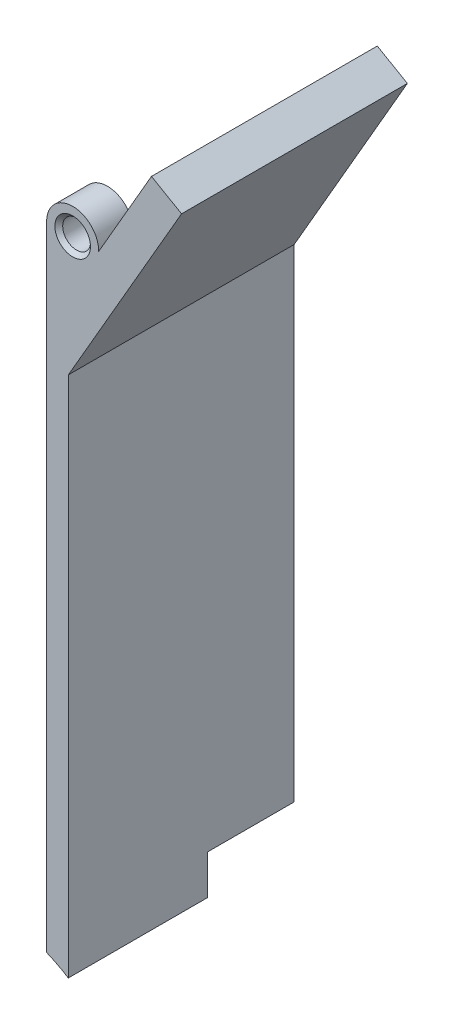
ISO-10303-21;
HEADER;
FILE_DESCRIPTION(('STEP AP214'),'2;1');
FILE_NAME('part.step','',(''),(''),'','','');
FILE_SCHEMA(('AUTOMOTIVE_DESIGN { 1 0 10303 214 1 1 1 1 }'));
ENDSEC;
DATA;
#1=APPLICATION_CONTEXT('core data for automotive mechanical design processes');
#2=APPLICATION_PROTOCOL_DEFINITION('international standard','automotive_design',2000,#1);
#3=PRODUCT_CONTEXT('',#1,'mechanical');
#4=PRODUCT('Part','Part','',(#3));
#5=PRODUCT_RELATED_PRODUCT_CATEGORY('part','',(#4));
#6=PRODUCT_DEFINITION_FORMATION('','',#4);
#7=PRODUCT_DEFINITION_CONTEXT('part definition',#1,'design');
#8=PRODUCT_DEFINITION('design','',#6,#7);
#9=PRODUCT_DEFINITION_SHAPE('','',#8);
#10=(LENGTH_UNIT() NAMED_UNIT(*) SI_UNIT(.MILLI.,.METRE.));
#11=(NAMED_UNIT(*) PLANE_ANGLE_UNIT() SI_UNIT($,.RADIAN.));
#12=(NAMED_UNIT(*) SI_UNIT($,.STERADIAN.) SOLID_ANGLE_UNIT());
#13=UNCERTAINTY_MEASURE_WITH_UNIT(LENGTH_MEASURE(1.E-05),#10,'distance_accuracy_value','');
#14=(GEOMETRIC_REPRESENTATION_CONTEXT(3) GLOBAL_UNCERTAINTY_ASSIGNED_CONTEXT((#13)) GLOBAL_UNIT_ASSIGNED_CONTEXT((#10,
#11,#12)) REPRESENTATION_CONTEXT('',''));
#15=CARTESIAN_POINT('',(0.,0.,0.));
#16=DIRECTION('',(0.,0.,1.));
#17=DIRECTION('',(1.,0.,0.));
#18=AXIS2_PLACEMENT_3D('',#15,#16,#17);
#19=CARTESIAN_POINT('',(60.1746976504819,0.,-15.));
#20=DIRECTION('',(1.,0.,0.));
#21=DIRECTION('',(0.,0.,1.));
#22=AXIS2_PLACEMENT_3D('',#19,#20,#21);
#23=PLANE('',#22);
#24=DIRECTION('',(0.,-1.,0.));
#25=VECTOR('',#24,1.);
#26=CARTESIAN_POINT('',(60.1746976504819,0.,-13.));
#27=LINE('',#26,#25);
#28=CARTESIAN_POINT('',(60.1746976504819,-38.1610373207469,-13.));
#29=VERTEX_POINT('',#28);
#30=CARTESIAN_POINT('',(60.1746976504819,-41.5716731926929,-13.));
#31=VERTEX_POINT('',#30);
#32=EDGE_CURVE('E180',#29,#31,#27,.T.);
#33=ORIENTED_EDGE('',*,*,#32,.T.);
#34=DIRECTION('',(0.,0.,-1.));
#35=VECTOR('',#34,1.);
#36=CARTESIAN_POINT('',(60.1746976504819,-41.5716731926929,-10.));
#37=LINE('',#36,#35);
#38=CARTESIAN_POINT('',(60.1746976504819,-41.5716731926929,-10.));
#39=VERTEX_POINT('',#38);
#40=EDGE_CURVE('E195',#39,#31,#37,.T.);
#41=ORIENTED_EDGE('',*,*,#40,.F.);
#42=DIRECTION('',(0.,-1.,0.));
#43=VECTOR('',#42,1.);
#44=CARTESIAN_POINT('',(60.1746976504819,0.,-10.));
#45=LINE('',#44,#43);
#46=CARTESIAN_POINT('',(60.1746976504819,-43.7084380241115,-10.));
#47=VERTEX_POINT('',#46);
#48=EDGE_CURVE('E57',#39,#47,#45,.T.);
#49=ORIENTED_EDGE('',*,*,#48,.T.);
#50=DIRECTION('',(0.,0.,1.));
#51=VECTOR('',#50,1.);
#52=CARTESIAN_POINT('',(60.1746976504819,-43.7084380241115,-15.));
#53=LINE('',#52,#51);
#54=CARTESIAN_POINT('',(60.1746976504819,-43.7084380241115,-2.));
#55=VERTEX_POINT('',#54);
#56=EDGE_CURVE('E220',#47,#55,#53,.T.);
#57=ORIENTED_EDGE('',*,*,#56,.T.);
#58=DIRECTION('',(0.,-1.,0.));
#59=VECTOR('',#58,1.);
#60=CARTESIAN_POINT('',(60.1746976504819,0.,-2.));
#61=LINE('',#60,#59);
#62=CARTESIAN_POINT('',(60.1746976504819,-7.25675770754768,-2.));
#63=VERTEX_POINT('',#62);
#64=EDGE_CURVE('E169',#63,#55,#61,.T.);
#65=ORIENTED_EDGE('',*,*,#64,.F.);
#66=DIRECTION('',(0.,0.,1.));
#67=VECTOR('',#66,1.);
#68=CARTESIAN_POINT('',(60.1746976504819,-7.25675770754768,-4.));
#69=LINE('',#68,#67);
#70=CARTESIAN_POINT('',(60.1746976504819,-7.25675770754768,-4.));
#71=VERTEX_POINT('',#70);
#72=EDGE_CURVE('E151',#71,#63,#69,.T.);
#73=ORIENTED_EDGE('',*,*,#72,.F.);
#74=DIRECTION('',(0.,1.,0.));
#75=VECTOR('',#74,1.);
#76=CARTESIAN_POINT('',(60.1746976504819,0.,-4.));
#77=LINE('',#76,#75);
#78=CARTESIAN_POINT('',(60.1746976504819,-12.4529101302543,-4.));
#79=VERTEX_POINT('',#78);
#80=EDGE_CURVE('E157',#79,#71,#77,.T.);
#81=ORIENTED_EDGE('',*,*,#80,.F.);
#82=DIRECTION('',(0.,0.,1.));
#83=VECTOR('',#82,1.);
#84=CARTESIAN_POINT('',(60.1746976504819,-12.4529101302543,-15.));
#85=LINE('',#84,#83);
#86=CARTESIAN_POINT('',(60.1746976504819,-12.4529101302543,-15.));
#87=VERTEX_POINT('',#86);
#88=EDGE_CURVE('E243',#87,#79,#85,.T.);
#89=ORIENTED_EDGE('',*,*,#88,.F.);
#90=DIRECTION('',(0.,-1.,0.));
#91=VECTOR('',#90,1.);
#92=CARTESIAN_POINT('',(60.1746976504819,0.,-15.));
#93=LINE('',#92,#91);
#94=CARTESIAN_POINT('',(60.1746976504819,-38.1610373207469,-15.));
#95=VERTEX_POINT('',#94);
#96=EDGE_CURVE('E208',#87,#95,#93,.T.);
#97=ORIENTED_EDGE('',*,*,#96,.T.);
#98=DIRECTION('',(0.,0.,-1.));
#99=VECTOR('',#98,1.);
#100=CARTESIAN_POINT('',(60.1746976504819,-38.1610373207469,-13.));
#101=LINE('',#100,#99);
#102=EDGE_CURVE('E190',#29,#95,#101,.T.);
#103=ORIENTED_EDGE('',*,*,#102,.F.);
#104=EDGE_LOOP('',(#33,#41,#49,#57,#65,#73,#81,#89,#97,#103));
#105=FACE_BOUND('',#104,.T.);
#106=ADVANCED_FACE('F48',(#105),#23,.F.);
#107=CARTESIAN_POINT('',(56.6746976504819,-52.,-15.));
#108=DIRECTION('',(0.,0.,1.));
#109=DIRECTION('',(-1.,0.,0.));
#110=AXIS2_PLACEMENT_3D('',#107,#108,#109);
#111=CYLINDRICAL_SURFACE('',#110,9.);
#112=CARTESIAN_POINT('',(56.6746976504819,-52.,-10.));
#113=DIRECTION('',(0.,0.,1.));
#114=DIRECTION('',(1.,0.,0.));
#115=AXIS2_PLACEMENT_3D('',#112,#113,#114);
#116=CIRCLE('',#115,9.);
#117=CARTESIAN_POINT('',(61.4246976504819,-44.3555575742897,-10.));
#118=VERTEX_POINT('',#117);
#119=EDGE_CURVE('E202',#47,#118,#116,.F.);
#120=ORIENTED_EDGE('',*,*,#119,.T.);
#121=DIRECTION('',(0.,0.,1.));
#122=VECTOR('',#121,1.);
#123=CARTESIAN_POINT('',(61.4246976504819,-44.3555575742896,-15.));
#124=LINE('',#123,#122);
#125=CARTESIAN_POINT('',(61.4246976504819,-44.3555575742896,-2.));
#126=VERTEX_POINT('',#125);
#127=EDGE_CURVE('E231',#118,#126,#124,.T.);
#128=ORIENTED_EDGE('',*,*,#127,.T.);
#129=CARTESIAN_POINT('',(56.6746976504819,-52.,-2.));
#130=DIRECTION('',(0.,0.,-1.));
#131=DIRECTION('',(-1.,0.,0.));
#132=AXIS2_PLACEMENT_3D('',#129,#130,#131);
#133=CIRCLE('',#132,9.);
#134=EDGE_CURVE('E207',#55,#126,#133,.T.);
#135=ORIENTED_EDGE('',*,*,#134,.F.);
#136=ORIENTED_EDGE('',*,*,#56,.F.);
#137=EDGE_LOOP('',(#120,#128,#135,#136));
#138=FACE_BOUND('',#137,.T.);
#139=ADVANCED_FACE('F50',(#138),#111,.F.);
#140=CARTESIAN_POINT('',(61.4246976504819,0.,-15.));
#141=DIRECTION('',(1.,0.,0.));
#142=DIRECTION('',(0.,-1.,0.));
#143=AXIS2_PLACEMENT_3D('',#140,#141,#142);
#144=PLANE('',#143);
#145=DIRECTION('',(0.,0.,-1.));
#146=VECTOR('',#145,1.);
#147=CARTESIAN_POINT('',(61.4246976504819,-42.0784325835078,-10.));
#148=LINE('',#147,#146);
#149=CARTESIAN_POINT('',(61.4246976504819,-42.0784325835078,-10.));
#150=VERTEX_POINT('',#149);
#151=CARTESIAN_POINT('',(61.4246976504819,-42.0784325835078,-15.));
#152=VERTEX_POINT('',#151);
#153=EDGE_CURVE('E199',#150,#152,#148,.T.);
#154=ORIENTED_EDGE('',*,*,#153,.T.);
#155=DIRECTION('',(0.,-1.,0.));
#156=VECTOR('',#155,1.);
#157=CARTESIAN_POINT('',(61.4246976504819,0.,-15.));
#158=LINE('',#157,#156);
#159=CARTESIAN_POINT('',(61.4246976504819,-14.2878466207932,-15.));
#160=VERTEX_POINT('',#159);
#161=EDGE_CURVE('E218',#160,#152,#158,.T.);
#162=ORIENTED_EDGE('',*,*,#161,.F.);
#163=DIRECTION('',(0.,0.,1.));
#164=VECTOR('',#163,1.);
#165=CARTESIAN_POINT('',(61.4246976504819,-14.2878466207932,-15.));
#166=LINE('',#165,#164);
#167=CARTESIAN_POINT('',(61.4246976504819,-14.2878466207932,-2.));
#168=VERTEX_POINT('',#167);
#169=EDGE_CURVE('E234',#160,#168,#166,.T.);
#170=ORIENTED_EDGE('',*,*,#169,.T.);
#171=DIRECTION('',(0.,-1.,0.));
#172=VECTOR('',#171,1.);
#173=CARTESIAN_POINT('',(61.4246976504819,0.,-2.));
#174=LINE('',#173,#172);
#175=EDGE_CURVE('E212',#168,#126,#174,.T.);
#176=ORIENTED_EDGE('',*,*,#175,.T.);
#177=ORIENTED_EDGE('',*,*,#127,.F.);
#178=DIRECTION('',(0.,-1.,0.));
#179=VECTOR('',#178,1.);
#180=CARTESIAN_POINT('',(61.4246976504819,0.,-10.));
#181=LINE('',#180,#179);
#182=EDGE_CURVE('E205',#150,#118,#181,.T.);
#183=ORIENTED_EDGE('',*,*,#182,.F.);
#184=EDGE_LOOP('',(#154,#162,#170,#176,#177,#183));
#185=FACE_BOUND('',#184,.T.);
#186=ADVANCED_FACE('F284',(#185),#144,.T.);
#187=CARTESIAN_POINT('',(67.9417389355681,-2.99999999999999,-15.));
#188=DIRECTION('',(0.86602540378444,-0.499999999999998,0.));
#189=DIRECTION('',(-0.499999999999998,-0.86602540378444,0.));
#190=AXIS2_PLACEMENT_3D('',#187,#188,#189);
#191=PLANE('',#190);
#192=DIRECTION('',(-0.499999999999998,-0.86602540378444,0.));
#193=VECTOR('',#192,1.);
#194=CARTESIAN_POINT('',(67.9417389355681,-2.99999999999999,-2.));
#195=LINE('',#194,#193);
#196=CARTESIAN_POINT('',(67.9417389355681,-2.99999999999997,-2.));
#197=VERTEX_POINT('',#196);
#198=EDGE_CURVE('E228',#197,#168,#195,.T.);
#199=ORIENTED_EDGE('',*,*,#198,.T.);
#200=ORIENTED_EDGE('',*,*,#169,.F.);
#201=DIRECTION('',(-0.499999999999998,-0.86602540378444,0.));
#202=VECTOR('',#201,1.);
#203=CARTESIAN_POINT('',(67.9417389355681,-2.99999999999999,-15.));
#204=LINE('',#203,#202);
#205=CARTESIAN_POINT('',(67.9417389355681,-2.99999999999997,-15.));
#206=VERTEX_POINT('',#205);
#207=EDGE_CURVE('E216',#206,#160,#204,.T.);
#208=ORIENTED_EDGE('',*,*,#207,.F.);
#209=DIRECTION('',(0.,0.,1.));
#210=VECTOR('',#209,1.);
#211=CARTESIAN_POINT('',(67.9417389355681,-2.99999999999997,-15.));
#212=LINE('',#211,#210);
#213=EDGE_CURVE('E237',#206,#197,#212,.T.);
#214=ORIENTED_EDGE('',*,*,#213,.T.);
#215=EDGE_LOOP('',(#199,#200,#208,#214));
#216=FACE_BOUND('',#215,.T.);
#217=ADVANCED_FACE('F294',(#216),#191,.T.);
#218=CARTESIAN_POINT('',(62.7455865128615,0.,-15.));
#219=DIRECTION('',(0.499999999999999,0.866025403784439,0.));
#220=DIRECTION('',(0.86602540378444,-0.499999999999999,0.));
#221=AXIS2_PLACEMENT_3D('',#218,#219,#220);
#222=PLANE('',#221);
#223=DIRECTION('',(0.86602540378444,-0.499999999999999,0.));
#224=VECTOR('',#223,1.);
#225=CARTESIAN_POINT('',(62.7455865128615,0.,-2.));
#226=LINE('',#225,#224);
#227=CARTESIAN_POINT('',(66.2096881279992,-1.99999999999997,-2.));
#228=VERTEX_POINT('',#227);
#229=EDGE_CURVE('E226',#228,#197,#226,.T.);
#230=ORIENTED_EDGE('',*,*,#229,.T.);
#231=ORIENTED_EDGE('',*,*,#213,.F.);
#232=DIRECTION('',(0.86602540378444,-0.499999999999999,0.));
#233=VECTOR('',#232,1.);
#234=CARTESIAN_POINT('',(62.7455865128615,0.,-15.));
#235=LINE('',#234,#233);
#236=CARTESIAN_POINT('',(66.2096881279992,-1.99999999999997,-15.));
#237=VERTEX_POINT('',#236);
#238=EDGE_CURVE('E214',#237,#206,#235,.T.);
#239=ORIENTED_EDGE('',*,*,#238,.F.);
#240=DIRECTION('',(0.,0.,1.));
#241=VECTOR('',#240,1.);
#242=CARTESIAN_POINT('',(66.2096881279992,-1.99999999999997,-15.));
#243=LINE('',#242,#241);
#244=EDGE_CURVE('E240',#237,#228,#243,.T.);
#245=ORIENTED_EDGE('',*,*,#244,.T.);
#246=EDGE_LOOP('',(#230,#231,#239,#245));
#247=FACE_BOUND('',#246,.T.);
#248=ADVANCED_FACE('F290',(#247),#222,.T.);
#249=CARTESIAN_POINT('',(66.2096881279992,-1.99999999999999,-15.));
#250=DIRECTION('',(-0.86602540378444,0.499999999999998,0.));
#251=DIRECTION('',(0.499999999999998,0.86602540378444,0.));
#252=AXIS2_PLACEMENT_3D('',#249,#250,#251);
#253=PLANE('',#252);
#254=DIRECTION('',(0.,0.,1.));
#255=VECTOR('',#254,1.);
#256=CARTESIAN_POINT('',(63.1746976504819,-7.25675770754767,-4.));
#257=LINE('',#256,#255);
#258=CARTESIAN_POINT('',(63.1746976504819,-7.25675770754767,-4.));
#259=VERTEX_POINT('',#258);
#260=CARTESIAN_POINT('',(63.1746976504819,-7.25675770754767,-2.));
#261=VERTEX_POINT('',#260);
#262=EDGE_CURVE('E154',#259,#261,#257,.T.);
#263=ORIENTED_EDGE('',*,*,#262,.T.);
#264=DIRECTION('',(0.499999999999998,0.86602540378444,0.));
#265=VECTOR('',#264,1.);
#266=CARTESIAN_POINT('',(66.2096881279992,-1.99999999999999,-2.));
#267=LINE('',#266,#265);
#268=EDGE_CURVE('E224',#261,#228,#267,.T.);
#269=ORIENTED_EDGE('',*,*,#268,.T.);
#270=ORIENTED_EDGE('',*,*,#244,.F.);
#271=DIRECTION('',(0.499999999999998,0.86602540378444,0.));
#272=VECTOR('',#271,1.);
#273=CARTESIAN_POINT('',(66.2096881279992,-1.99999999999999,-15.));
#274=LINE('',#273,#272);
#275=EDGE_CURVE('E211',#87,#237,#274,.T.);
#276=ORIENTED_EDGE('',*,*,#275,.F.);
#277=ORIENTED_EDGE('',*,*,#88,.T.);
#278=DIRECTION('',(-0.499999999999998,-0.86602540378444,0.));
#279=VECTOR('',#278,1.);
#280=CARTESIAN_POINT('',(66.2096881279992,-1.99999999999999,-4.));
#281=LINE('',#280,#279);
#282=EDGE_CURVE('E12',#259,#79,#281,.T.);
#283=ORIENTED_EDGE('',*,*,#282,.F.);
#284=EDGE_LOOP('',(#263,#269,#270,#276,#277,#283));
#285=FACE_BOUND('',#284,.T.);
#286=ADVANCED_FACE('F287',(#285),#253,.T.);
#287=CARTESIAN_POINT('',(62.7455865128615,0.,-15.));
#288=DIRECTION('',(0.,0.,1.));
#289=DIRECTION('',(-1.,0.,0.));
#290=AXIS2_PLACEMENT_3D('',#287,#288,#289);
#291=PLANE('',#290);
#292=CARTESIAN_POINT('',(58.6746976504819,-39.6610373207469,-15.));
#293=DIRECTION('',(0.,0.,1.));
#294=DIRECTION('',(1.,0.,0.));
#295=AXIS2_PLACEMENT_3D('',#292,#293,#294);
#296=CIRCLE('',#295,1.025);
#297=CARTESIAN_POINT('',(59.6996976504819,-39.6610373207469,-15.));
#298=VERTEX_POINT('',#297);
#299=EDGE_CURVE('E263',#298,#298,#296,.T.);
#300=ORIENTED_EDGE('',*,*,#299,.T.);
#301=EDGE_LOOP('',(#300));
#302=FACE_BOUND('',#301,.T.);
#303=ORIENTED_EDGE('',*,*,#96,.F.);
#304=ORIENTED_EDGE('',*,*,#275,.T.);
#305=ORIENTED_EDGE('',*,*,#238,.T.);
#306=ORIENTED_EDGE('',*,*,#207,.T.);
#307=ORIENTED_EDGE('',*,*,#161,.T.);
#308=CARTESIAN_POINT('',(56.6746976504819,-52.,-15.));
#309=DIRECTION('',(0.,0.,1.));
#310=DIRECTION('',(1.,0.,0.));
#311=AXIS2_PLACEMENT_3D('',#308,#309,#310);
#312=CIRCLE('',#311,11.);
#313=CARTESIAN_POINT('',(58.4346976504819,-41.1417128422573,-15.));
#314=VERTEX_POINT('',#313);
#315=EDGE_CURVE('E73',#152,#314,#312,.T.);
#316=ORIENTED_EDGE('',*,*,#315,.T.);
#317=CARTESIAN_POINT('',(58.6746976504819,-39.6610373207469,-15.));
#318=DIRECTION('',(0.,0.,1.));
#319=DIRECTION('',(1.,0.,0.));
#320=AXIS2_PLACEMENT_3D('',#317,#318,#319);
#321=CIRCLE('',#320,1.5);
#322=CARTESIAN_POINT('',(58.6746976504819,-38.1610373207469,-15.));
#323=VERTEX_POINT('',#322);
#324=EDGE_CURVE('E171',#323,#314,#321,.T.);
#325=ORIENTED_EDGE('',*,*,#324,.F.);
#326=DIRECTION('',(1.,0.,0.));
#327=VECTOR('',#326,1.);
#328=CARTESIAN_POINT('',(62.7455865128615,-38.1610373207469,-15.));
#329=LINE('',#328,#327);
#330=EDGE_CURVE('E65',#323,#95,#329,.T.);
#331=ORIENTED_EDGE('',*,*,#330,.T.);
#332=EDGE_LOOP('',(#303,#304,#305,#306,#307,#316,#325,#331));
#333=FACE_BOUND('',#332,.T.);
#334=ADVANCED_FACE('F267',(#302,#333),#291,.F.);
#335=CARTESIAN_POINT('',(62.7455865128615,0.,-2.));
#336=DIRECTION('',(0.,0.,1.));
#337=DIRECTION('',(-1.,0.,0.));
#338=AXIS2_PLACEMENT_3D('',#335,#336,#337);
#339=PLANE('',#338);
#340=CARTESIAN_POINT('',(61.6746976504819,-7.25675770754768,-2.));
#341=DIRECTION('',(0.,0.,-1.));
#342=DIRECTION('',(-1.,0.,0.));
#343=AXIS2_PLACEMENT_3D('',#340,#341,#342);
#344=CIRCLE('',#343,1.025);
#345=CARTESIAN_POINT('',(60.6496976504819,-7.25675770754768,-2.));
#346=VERTEX_POINT('',#345);
#347=EDGE_CURVE('E253',#346,#346,#344,.T.);
#348=ORIENTED_EDGE('',*,*,#347,.T.);
#349=EDGE_LOOP('',(#348));
#350=FACE_BOUND('',#349,.T.);
#351=CARTESIAN_POINT('',(61.6746976504819,-7.25675770754768,-2.));
#352=DIRECTION('',(0.,0.,-1.));
#353=DIRECTION('',(-1.,0.,0.));
#354=AXIS2_PLACEMENT_3D('',#351,#352,#353);
#355=CIRCLE('',#354,1.5);
#356=EDGE_CURVE('E164',#63,#261,#355,.T.);
#357=ORIENTED_EDGE('',*,*,#356,.F.);
#358=ORIENTED_EDGE('',*,*,#64,.T.);
#359=ORIENTED_EDGE('',*,*,#134,.T.);
#360=ORIENTED_EDGE('',*,*,#175,.F.);
#361=ORIENTED_EDGE('',*,*,#198,.F.);
#362=ORIENTED_EDGE('',*,*,#229,.F.);
#363=ORIENTED_EDGE('',*,*,#268,.F.);
#364=EDGE_LOOP('',(#357,#358,#359,#360,#361,#362,#363));
#365=FACE_BOUND('',#364,.T.);
#366=ADVANCED_FACE('F302',(#350,#365),#339,.T.);
#367=CARTESIAN_POINT('',(56.6746976504819,-52.,-10.));
#368=DIRECTION('',(0.,0.,-1.));
#369=DIRECTION('',(1.,0.,0.));
#370=AXIS2_PLACEMENT_3D('',#367,#368,#369);
#371=CYLINDRICAL_SURFACE('',#370,11.);
#372=ORIENTED_EDGE('',*,*,#153,.F.);
#373=CARTESIAN_POINT('',(56.6746976504819,-52.,-10.));
#374=DIRECTION('',(0.,0.,1.));
#375=DIRECTION('',(1.,0.,0.));
#376=AXIS2_PLACEMENT_3D('',#373,#374,#375);
#377=CIRCLE('',#376,11.);
#378=EDGE_CURVE('E193',#150,#39,#377,.T.);
#379=ORIENTED_EDGE('',*,*,#378,.T.);
#380=ORIENTED_EDGE('',*,*,#40,.T.);
#381=CARTESIAN_POINT('',(56.6746976504819,-52.,-13.));
#382=DIRECTION('',(0.,0.,1.));
#383=DIRECTION('',(1.,0.,0.));
#384=AXIS2_PLACEMENT_3D('',#381,#382,#383);
#385=CIRCLE('',#384,11.);
#386=CARTESIAN_POINT('',(58.4346976504819,-41.1417128422573,-13.));
#387=VERTEX_POINT('',#386);
#388=EDGE_CURVE('E177',#31,#387,#385,.T.);
#389=ORIENTED_EDGE('',*,*,#388,.T.);
#390=DIRECTION('',(0.,0.,-1.));
#391=VECTOR('',#390,1.);
#392=CARTESIAN_POINT('',(58.4346976504819,-41.1417128422573,-13.));
#393=LINE('',#392,#391);
#394=EDGE_CURVE('E184',#387,#314,#393,.T.);
#395=ORIENTED_EDGE('',*,*,#394,.T.);
#396=ORIENTED_EDGE('',*,*,#315,.F.);
#397=EDGE_LOOP('',(#372,#379,#380,#389,#395,#396));
#398=FACE_BOUND('',#397,.T.);
#399=ADVANCED_FACE('F305',(#398),#371,.F.);
#400=CARTESIAN_POINT('',(56.6746976504819,-52.,-10.));
#401=DIRECTION('',(0.,0.,-1.));
#402=DIRECTION('',(1.,0.,0.));
#403=AXIS2_PLACEMENT_3D('',#400,#401,#402);
#404=PLANE('',#403);
#405=ORIENTED_EDGE('',*,*,#378,.F.);
#406=ORIENTED_EDGE('',*,*,#182,.T.);
#407=ORIENTED_EDGE('',*,*,#119,.F.);
#408=ORIENTED_EDGE('',*,*,#48,.F.);
#409=EDGE_LOOP('',(#405,#406,#407,#408));
#410=FACE_BOUND('',#409,.T.);
#411=ADVANCED_FACE('F311',(#410),#404,.T.);
#412=CARTESIAN_POINT('',(58.6746976504819,-39.6610373207469,-13.));
#413=DIRECTION('',(0.,0.,-1.));
#414=DIRECTION('',(1.,0.,0.));
#415=AXIS2_PLACEMENT_3D('',#412,#413,#414);
#416=CYLINDRICAL_SURFACE('',#415,1.5);
#417=ORIENTED_EDGE('',*,*,#324,.T.);
#418=ORIENTED_EDGE('',*,*,#394,.F.);
#419=CARTESIAN_POINT('',(58.6746976504819,-39.6610373207469,-13.));
#420=DIRECTION('',(0.,0.,1.));
#421=DIRECTION('',(1.,0.,0.));
#422=AXIS2_PLACEMENT_3D('',#419,#420,#421);
#423=CIRCLE('',#422,1.5);
#424=CARTESIAN_POINT('',(58.6746976504819,-38.1610373207469,-13.));
#425=VERTEX_POINT('',#424);
#426=EDGE_CURVE('E175',#425,#387,#423,.T.);
#427=ORIENTED_EDGE('',*,*,#426,.F.);
#428=DIRECTION('',(0.,0.,-1.));
#429=VECTOR('',#428,1.);
#430=CARTESIAN_POINT('',(58.6746976504819,-38.1610373207469,-13.));
#431=LINE('',#430,#429);
#432=EDGE_CURVE('E188',#425,#323,#431,.T.);
#433=ORIENTED_EDGE('',*,*,#432,.T.);
#434=EDGE_LOOP('',(#417,#418,#427,#433));
#435=FACE_BOUND('',#434,.T.);
#436=ADVANCED_FACE('F314',(#435),#416,.T.);
#437=CARTESIAN_POINT('',(62.7455865128615,-38.1610373207469,-13.));
#438=DIRECTION('',(0.,-1.,0.));
#439=DIRECTION('',(0.,0.,-1.));
#440=AXIS2_PLACEMENT_3D('',#437,#438,#439);
#441=PLANE('',#440);
#442=ORIENTED_EDGE('',*,*,#330,.F.);
#443=ORIENTED_EDGE('',*,*,#432,.F.);
#444=DIRECTION('',(1.,0.,0.));
#445=VECTOR('',#444,1.);
#446=CARTESIAN_POINT('',(62.7455865128615,-38.1610373207469,-13.));
#447=LINE('',#446,#445);
#448=EDGE_CURVE('E182',#425,#29,#447,.T.);
#449=ORIENTED_EDGE('',*,*,#448,.T.);
#450=ORIENTED_EDGE('',*,*,#102,.T.);
#451=EDGE_LOOP('',(#442,#443,#449,#450));
#452=FACE_BOUND('',#451,.T.);
#453=ADVANCED_FACE('F318',(#452),#441,.F.);
#454=CARTESIAN_POINT('',(62.7455865128615,0.,-13.));
#455=DIRECTION('',(0.,0.,-1.));
#456=DIRECTION('',(1.,0.,0.));
#457=AXIS2_PLACEMENT_3D('',#454,#455,#456);
#458=PLANE('',#457);
#459=CARTESIAN_POINT('',(58.6746976504819,-39.6610373207469,-13.));
#460=DIRECTION('',(0.,0.,1.));
#461=DIRECTION('',(1.,0.,0.));
#462=AXIS2_PLACEMENT_3D('',#459,#460,#461);
#463=CIRCLE('',#462,0.799999999999989);
#464=CARTESIAN_POINT('',(59.4746976504819,-39.6610373207469,-13.));
#465=VERTEX_POINT('',#464);
#466=EDGE_CURVE('E52',#465,#465,#463,.T.);
#467=ORIENTED_EDGE('',*,*,#466,.F.);
#468=EDGE_LOOP('',(#467));
#469=FACE_BOUND('',#468,.T.);
#470=ORIENTED_EDGE('',*,*,#426,.T.);
#471=ORIENTED_EDGE('',*,*,#388,.F.);
#472=ORIENTED_EDGE('',*,*,#32,.F.);
#473=ORIENTED_EDGE('',*,*,#448,.F.);
#474=EDGE_LOOP('',(#470,#471,#472,#473));
#475=FACE_BOUND('',#474,.T.);
#476=ADVANCED_FACE('F322',(#469,#475),#458,.F.);
#477=CARTESIAN_POINT('',(61.6746976504819,-7.25675770754768,-4.));
#478=DIRECTION('',(0.,0.,1.));
#479=DIRECTION('',(-1.,0.,0.));
#480=AXIS2_PLACEMENT_3D('',#477,#478,#479);
#481=CYLINDRICAL_SURFACE('',#480,1.5);
#482=CARTESIAN_POINT('',(61.6746976504819,-7.25675770754768,-4.));
#483=DIRECTION('',(0.,0.,-1.));
#484=DIRECTION('',(-1.,0.,0.));
#485=AXIS2_PLACEMENT_3D('',#482,#483,#484);
#486=CIRCLE('',#485,1.5);
#487=EDGE_CURVE('E147',#71,#259,#486,.T.);
#488=ORIENTED_EDGE('',*,*,#487,.F.);
#489=ORIENTED_EDGE('',*,*,#72,.T.);
#490=ORIENTED_EDGE('',*,*,#356,.T.);
#491=ORIENTED_EDGE('',*,*,#262,.F.);
#492=EDGE_LOOP('',(#488,#489,#490,#491));
#493=FACE_BOUND('',#492,.T.);
#494=ADVANCED_FACE('F149',(#493),#481,.T.);
#495=CARTESIAN_POINT('',(62.7455865128615,0.,-4.));
#496=DIRECTION('',(0.,0.,1.));
#497=DIRECTION('',(-1.,0.,0.));
#498=AXIS2_PLACEMENT_3D('',#495,#496,#497);
#499=PLANE('',#498);
#500=CARTESIAN_POINT('',(61.6746976504819,-7.25675770754768,-4.));
#501=DIRECTION('',(0.,0.,-1.));
#502=DIRECTION('',(-1.,0.,0.));
#503=AXIS2_PLACEMENT_3D('',#500,#501,#502);
#504=CIRCLE('',#503,0.799999999999989);
#505=CARTESIAN_POINT('',(60.8746976504819,-7.25675770754768,-4.));
#506=VERTEX_POINT('',#505);
#507=EDGE_CURVE('E247',#506,#506,#504,.T.);
#508=ORIENTED_EDGE('',*,*,#507,.F.);
#509=EDGE_LOOP('',(#508));
#510=FACE_BOUND('',#509,.T.);
#511=ORIENTED_EDGE('',*,*,#282,.T.);
#512=ORIENTED_EDGE('',*,*,#80,.T.);
#513=ORIENTED_EDGE('',*,*,#487,.T.);
#514=EDGE_LOOP('',(#511,#512,#513));
#515=FACE_BOUND('',#514,.T.);
#516=ADVANCED_FACE('F160',(#510,#515),#499,.F.);
#517=CARTESIAN_POINT('',(61.6746976504819,-7.25675770754768,-2.));
#518=DIRECTION('',(0.,0.,1.));
#519=DIRECTION('',(-1.,0.,0.));
#520=AXIS2_PLACEMENT_3D('',#517,#518,#519);
#521=CYLINDRICAL_SURFACE('',#520,0.799999999999989);
#522=CARTESIAN_POINT('',(61.6746976504819,-7.25675770754768,-2.225));
#523=DIRECTION('',(0.,0.,-1.));
#524=DIRECTION('',(-1.,0.,0.));
#525=AXIS2_PLACEMENT_3D('',#522,#523,#524);
#526=CIRCLE('',#525,0.79999999999999);
#527=CARTESIAN_POINT('',(60.8746976504819,-7.25675770754768,-2.225));
#528=VERTEX_POINT('',#527);
#529=EDGE_CURVE('E249',#528,#528,#526,.T.);
#530=ORIENTED_EDGE('',*,*,#529,.F.);
#531=EDGE_LOOP('',(#530));
#532=FACE_BOUND('',#531,.T.);
#533=ORIENTED_EDGE('',*,*,#507,.T.);
#534=EDGE_LOOP('',(#533));
#535=FACE_BOUND('',#534,.T.);
#536=ADVANCED_FACE('F331',(#532,#535),#521,.F.);
#537=CARTESIAN_POINT('',(61.6746976504819,-7.25675770754768,-2.));
#538=DIRECTION('',(0.,0.,1.));
#539=DIRECTION('',(-1.,0.,0.));
#540=AXIS2_PLACEMENT_3D('',#537,#538,#539);
#541=CONICAL_SURFACE('',#540,1.025,0.78539816339746);
#542=ORIENTED_EDGE('',*,*,#529,.T.);
#543=EDGE_LOOP('',(#542));
#544=FACE_BOUND('',#543,.T.);
#545=ORIENTED_EDGE('',*,*,#347,.F.);
#546=EDGE_LOOP('',(#545));
#547=FACE_BOUND('',#546,.T.);
#548=ADVANCED_FACE('F277',(#544,#547),#541,.F.);
#549=CARTESIAN_POINT('',(58.6746976504819,-39.6610373207469,-15.));
#550=DIRECTION('',(0.,0.,-1.));
#551=DIRECTION('',(1.,0.,0.));
#552=AXIS2_PLACEMENT_3D('',#549,#550,#551);
#553=CYLINDRICAL_SURFACE('',#552,0.799999999999989);
#554=CARTESIAN_POINT('',(58.6746976504819,-39.6610373207469,-14.775));
#555=DIRECTION('',(0.,0.,1.));
#556=DIRECTION('',(1.,0.,0.));
#557=AXIS2_PLACEMENT_3D('',#554,#555,#556);
#558=CIRCLE('',#557,0.79999999999999);
#559=CARTESIAN_POINT('',(59.4746976504819,-39.6610373207469,-14.775));
#560=VERTEX_POINT('',#559);
#561=EDGE_CURVE('E260',#560,#560,#558,.T.);
#562=ORIENTED_EDGE('',*,*,#561,.F.);
#563=EDGE_LOOP('',(#562));
#564=FACE_BOUND('',#563,.T.);
#565=ORIENTED_EDGE('',*,*,#466,.T.);
#566=EDGE_LOOP('',(#565));
#567=FACE_BOUND('',#566,.T.);
#568=ADVANCED_FACE('F271',(#564,#567),#553,.F.);
#569=CARTESIAN_POINT('',(58.6746976504819,-39.6610373207469,-15.));
#570=DIRECTION('',(0.,0.,-1.));
#571=DIRECTION('',(1.,0.,0.));
#572=AXIS2_PLACEMENT_3D('',#569,#570,#571);
#573=CONICAL_SURFACE('',#572,1.025,0.78539816339746);
#574=ORIENTED_EDGE('',*,*,#561,.T.);
#575=EDGE_LOOP('',(#574));
#576=FACE_BOUND('',#575,.T.);
#577=ORIENTED_EDGE('',*,*,#299,.F.);
#578=EDGE_LOOP('',(#577));
#579=FACE_BOUND('',#578,.T.);
#580=ADVANCED_FACE('F269',(#576,#579),#573,.F.);
#581=CLOSED_SHELL('',(#106,#139,#186,#217,#248,#286,#334,#366,#399,#411,#436,#453,#476,#494,
#516,#536,#548,#568,#580));
#582=MANIFOLD_SOLID_BREP('B2',#581);
#583=ADVANCED_BREP_SHAPE_REPRESENTATION('',(#18,#582),#14);
#584=SHAPE_DEFINITION_REPRESENTATION(#9,#583);
ENDSEC;
END-ISO-10303-21;
